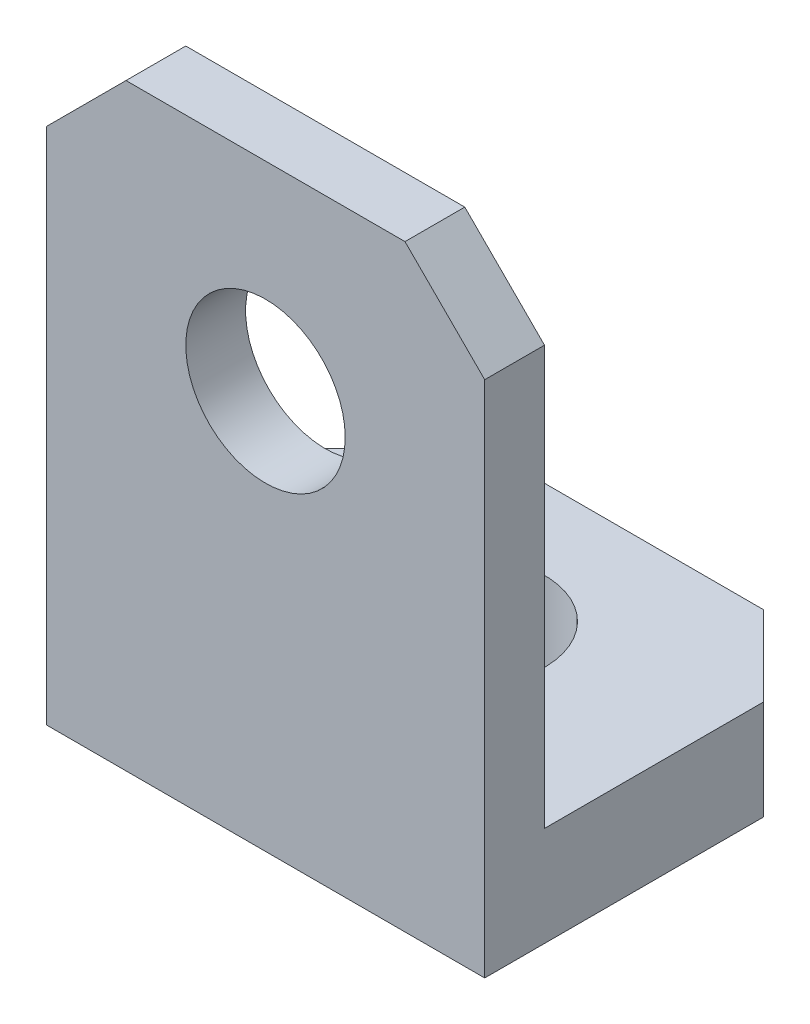
ISO-10303-21;
HEADER;
FILE_DESCRIPTION(('STEP AP214'),'2;1');
FILE_NAME('part.step','',(''),(''),'','','');
FILE_SCHEMA(('AUTOMOTIVE_DESIGN { 1 0 10303 214 1 1 1 1 }'));
ENDSEC;
DATA;
#1=APPLICATION_CONTEXT('core data for automotive mechanical design processes');
#2=APPLICATION_PROTOCOL_DEFINITION('international standard','automotive_design',2000,#1);
#3=PRODUCT_CONTEXT('',#1,'mechanical');
#4=PRODUCT('Part','Part','',(#3));
#5=PRODUCT_RELATED_PRODUCT_CATEGORY('part','',(#4));
#6=PRODUCT_DEFINITION_FORMATION('','',#4);
#7=PRODUCT_DEFINITION_CONTEXT('part definition',#1,'design');
#8=PRODUCT_DEFINITION('design','',#6,#7);
#9=PRODUCT_DEFINITION_SHAPE('','',#8);
#10=(LENGTH_UNIT() NAMED_UNIT(*) SI_UNIT(.MILLI.,.METRE.));
#11=(NAMED_UNIT(*) PLANE_ANGLE_UNIT() SI_UNIT($,.RADIAN.));
#12=(NAMED_UNIT(*) SI_UNIT($,.STERADIAN.) SOLID_ANGLE_UNIT());
#13=UNCERTAINTY_MEASURE_WITH_UNIT(LENGTH_MEASURE(1.E-05),#10,'distance_accuracy_value','');
#14=(GEOMETRIC_REPRESENTATION_CONTEXT(3) GLOBAL_UNCERTAINTY_ASSIGNED_CONTEXT((#13)) GLOBAL_UNIT_ASSIGNED_CONTEXT((#10,
#11,#12)) REPRESENTATION_CONTEXT('',''));
#15=CARTESIAN_POINT('',(0.,0.,0.));
#16=DIRECTION('',(0.,0.,1.));
#17=DIRECTION('',(1.,0.,0.));
#18=AXIS2_PLACEMENT_3D('',#15,#16,#17);
#19=CARTESIAN_POINT('',(0.,5.,0.));
#20=DIRECTION('',(0.,1.,0.));
#21=DIRECTION('',(0.,0.,1.));
#22=AXIS2_PLACEMENT_3D('',#19,#20,#21);
#23=PLANE('',#22);
#24=CARTESIAN_POINT('',(-0.467181467181457,5.,1.97683397683397));
#25=DIRECTION('',(0.,1.,0.));
#26=DIRECTION('',(0.,0.,1.));
#27=AXIS2_PLACEMENT_3D('',#24,#25,#26);
#28=CIRCLE('',#27,4.);
#29=CARTESIAN_POINT('',(-0.467181467181457,5.,5.97683397683397));
#30=VERTEX_POINT('',#29);
#31=EDGE_CURVE('E147',#30,#30,#28,.T.);
#32=ORIENTED_EDGE('',*,*,#31,.F.);
#33=EDGE_LOOP('',(#32));
#34=FACE_BOUND('',#33,.T.);
#35=DIRECTION('',(0.,0.,-1.));
#36=VECTOR('',#35,1.);
#37=CARTESIAN_POINT('',(10.5328185328185,5.,-6.02316602316603));
#38=LINE('',#37,#36);
#39=CARTESIAN_POINT('',(10.5328185328185,5.,8.97683397683397));
#40=VERTEX_POINT('',#39);
#41=CARTESIAN_POINT('',(10.5328185328185,5.,-2.02316602316601));
#42=VERTEX_POINT('',#41);
#43=EDGE_CURVE('E131',#40,#42,#38,.T.);
#44=ORIENTED_EDGE('',*,*,#43,.T.);
#45=DIRECTION('',(0.707106781186547,0.,0.707106781186548));
#46=VECTOR('',#45,1.);
#47=CARTESIAN_POINT('',(6.27799227799229,5.,-6.27799227799227));
#48=LINE('',#47,#46);
#49=CARTESIAN_POINT('',(6.53281853281853,5.,-6.02316602316603));
#50=VERTEX_POINT('',#49);
#51=EDGE_CURVE('E185',#42,#50,#48,.F.);
#52=ORIENTED_EDGE('',*,*,#51,.T.);
#53=DIRECTION('',(-1.,0.,0.));
#54=VECTOR('',#53,1.);
#55=CARTESIAN_POINT('',(-11.4671814671815,5.,-6.02316602316603));
#56=LINE('',#55,#54);
#57=CARTESIAN_POINT('',(-7.46718146718144,5.,-6.02316602316603));
#58=VERTEX_POINT('',#57);
#59=EDGE_CURVE('E154',#50,#58,#56,.T.);
#60=ORIENTED_EDGE('',*,*,#59,.T.);
#61=DIRECTION('',(0.707106781186549,0.,-0.707106781186546));
#62=VECTOR('',#61,1.);
#63=CARTESIAN_POINT('',(-6.74517374517372,5.,-6.74517374517375));
#64=LINE('',#63,#62);
#65=CARTESIAN_POINT('',(-11.4671814671815,5.,-2.02316602316603));
#66=VERTEX_POINT('',#65);
#67=EDGE_CURVE('E130',#58,#66,#64,.F.);
#68=ORIENTED_EDGE('',*,*,#67,.T.);
#69=DIRECTION('',(0.,0.,1.));
#70=VECTOR('',#69,1.);
#71=CARTESIAN_POINT('',(-11.4671814671815,5.,-6.02316602316603));
#72=LINE('',#71,#70);
#73=CARTESIAN_POINT('',(-11.4671814671815,5.,8.97683397683397));
#74=VERTEX_POINT('',#73);
#75=EDGE_CURVE('E115',#66,#74,#72,.T.);
#76=ORIENTED_EDGE('',*,*,#75,.T.);
#77=DIRECTION('',(1.,0.,0.));
#78=VECTOR('',#77,1.);
#79=CARTESIAN_POINT('',(-11.4671814671815,5.,8.97683397683397));
#80=LINE('',#79,#78);
#81=EDGE_CURVE('E121',#74,#40,#80,.T.);
#82=ORIENTED_EDGE('',*,*,#81,.T.);
#83=EDGE_LOOP('',(#44,#52,#60,#68,#76,#82));
#84=FACE_BOUND('',#83,.T.);
#85=ADVANCED_FACE('F35',(#34,#84),#23,.T.);
#86=CARTESIAN_POINT('',(0.,0.,0.));
#87=DIRECTION('',(0.,1.,0.));
#88=DIRECTION('',(0.,0.,1.));
#89=AXIS2_PLACEMENT_3D('',#86,#87,#88);
#90=PLANE('',#89);
#91=DIRECTION('',(-1.,0.,0.));
#92=VECTOR('',#91,1.);
#93=CARTESIAN_POINT('',(-11.4671814671815,0.,-6.02316602316603));
#94=LINE('',#93,#92);
#95=CARTESIAN_POINT('',(6.53281853281853,0.,-6.02316602316603));
#96=VERTEX_POINT('',#95);
#97=CARTESIAN_POINT('',(-7.46718146718144,0.,-6.02316602316603));
#98=VERTEX_POINT('',#97);
#99=EDGE_CURVE('E132',#96,#98,#94,.T.);
#100=ORIENTED_EDGE('',*,*,#99,.F.);
#101=DIRECTION('',(-0.707106781186547,0.,-0.707106781186548));
#102=VECTOR('',#101,1.);
#103=CARTESIAN_POINT('',(6.53281853281853,0.,-6.02316602316603));
#104=LINE('',#103,#102);
#105=CARTESIAN_POINT('',(10.5328185328185,0.,-2.02316602316601));
#106=VERTEX_POINT('',#105);
#107=EDGE_CURVE('E177',#96,#106,#104,.F.);
#108=ORIENTED_EDGE('',*,*,#107,.T.);
#109=DIRECTION('',(0.,0.,-1.));
#110=VECTOR('',#109,1.);
#111=CARTESIAN_POINT('',(10.5328185328185,0.,-6.02316602316603));
#112=LINE('',#111,#110);
#113=CARTESIAN_POINT('',(10.5328185328185,0.,11.976833976834));
#114=VERTEX_POINT('',#113);
#115=EDGE_CURVE('E162',#114,#106,#112,.T.);
#116=ORIENTED_EDGE('',*,*,#115,.F.);
#117=DIRECTION('',(1.,0.,0.));
#118=VECTOR('',#117,1.);
#119=CARTESIAN_POINT('',(-11.4671814671815,0.,11.976833976834));
#120=LINE('',#119,#118);
#121=CARTESIAN_POINT('',(-11.4671814671815,0.,11.976833976834));
#122=VERTEX_POINT('',#121);
#123=EDGE_CURVE('E159',#122,#114,#120,.T.);
#124=ORIENTED_EDGE('',*,*,#123,.F.);
#125=DIRECTION('',(0.,0.,1.));
#126=VECTOR('',#125,1.);
#127=CARTESIAN_POINT('',(-11.4671814671815,0.,-6.02316602316603));
#128=LINE('',#127,#126);
#129=CARTESIAN_POINT('',(-11.4671814671815,0.,-2.02316602316603));
#130=VERTEX_POINT('',#129);
#131=EDGE_CURVE('E150',#130,#122,#128,.T.);
#132=ORIENTED_EDGE('',*,*,#131,.F.);
#133=DIRECTION('',(-0.707106781186549,0.,0.707106781186546));
#134=VECTOR('',#133,1.);
#135=CARTESIAN_POINT('',(-11.4671814671815,0.,-2.02316602316603));
#136=LINE('',#135,#134);
#137=EDGE_CURVE('E175',#130,#98,#136,.F.);
#138=ORIENTED_EDGE('',*,*,#137,.T.);
#139=EDGE_LOOP('',(#100,#108,#116,#124,#132,#138));
#140=FACE_BOUND('',#139,.T.);
#141=CARTESIAN_POINT('',(-0.467181467181457,0.,1.97683397683397));
#142=DIRECTION('',(0.,1.,0.));
#143=DIRECTION('',(0.,0.,1.));
#144=AXIS2_PLACEMENT_3D('',#141,#142,#143);
#145=CIRCLE('',#144,4.);
#146=CARTESIAN_POINT('',(-0.467181467181457,0.,5.97683397683397));
#147=VERTEX_POINT('',#146);
#148=EDGE_CURVE('E143',#147,#147,#145,.T.);
#149=ORIENTED_EDGE('',*,*,#148,.T.);
#150=EDGE_LOOP('',(#149));
#151=FACE_BOUND('',#150,.T.);
#152=ADVANCED_FACE('F221',(#140,#151),#90,.F.);
#153=CARTESIAN_POINT('',(-11.4671814671815,5.,-6.02316602316603));
#154=DIRECTION('',(1.,0.,0.));
#155=DIRECTION('',(0.,0.,-1.));
#156=AXIS2_PLACEMENT_3D('',#153,#154,#155);
#157=PLANE('',#156);
#158=ORIENTED_EDGE('',*,*,#75,.F.);
#159=DIRECTION('',(0.,-1.,0.));
#160=VECTOR('',#159,1.);
#161=CARTESIAN_POINT('',(-11.4671814671815,5.,-2.02316602316603));
#162=LINE('',#161,#160);
#163=EDGE_CURVE('E188',#66,#130,#162,.T.);
#164=ORIENTED_EDGE('',*,*,#163,.T.);
#165=ORIENTED_EDGE('',*,*,#131,.T.);
#166=DIRECTION('',(0.,-1.,0.));
#167=VECTOR('',#166,1.);
#168=CARTESIAN_POINT('',(-11.4671814671815,5.,11.976833976834));
#169=LINE('',#168,#167);
#170=CARTESIAN_POINT('',(-11.4671814671815,26.,11.976833976834));
#171=VERTEX_POINT('',#170);
#172=EDGE_CURVE('E168',#171,#122,#169,.T.);
#173=ORIENTED_EDGE('',*,*,#172,.F.);
#174=DIRECTION('',(0.,0.,-1.));
#175=VECTOR('',#174,1.);
#176=CARTESIAN_POINT('',(-11.4671814671815,26.,8.97683397683397));
#177=LINE('',#176,#175);
#178=CARTESIAN_POINT('',(-11.4671814671815,26.,8.97683397683397));
#179=VERTEX_POINT('',#178);
#180=EDGE_CURVE('E119',#171,#179,#177,.T.);
#181=ORIENTED_EDGE('',*,*,#180,.T.);
#182=DIRECTION('',(0.,-1.,0.));
#183=VECTOR('',#182,1.);
#184=CARTESIAN_POINT('',(-11.4671814671815,5.,8.97683397683397));
#185=LINE('',#184,#183);
#186=EDGE_CURVE('E111',#179,#74,#185,.T.);
#187=ORIENTED_EDGE('',*,*,#186,.T.);
#188=EDGE_LOOP('',(#158,#164,#165,#173,#181,#187));
#189=FACE_BOUND('',#188,.T.);
#190=ADVANCED_FACE('F113',(#189),#157,.F.);
#191=CARTESIAN_POINT('',(-11.4671814671815,5.,11.976833976834));
#192=DIRECTION('',(0.,0.,-1.));
#193=DIRECTION('',(-1.,0.,0.));
#194=AXIS2_PLACEMENT_3D('',#191,#192,#193);
#195=PLANE('',#194);
#196=DIRECTION('',(0.,-1.,0.));
#197=VECTOR('',#196,1.);
#198=CARTESIAN_POINT('',(10.5328185328185,5.,11.976833976834));
#199=LINE('',#198,#197);
#200=CARTESIAN_POINT('',(10.5328185328185,26.,11.976833976834));
#201=VERTEX_POINT('',#200);
#202=EDGE_CURVE('E156',#201,#114,#199,.T.);
#203=ORIENTED_EDGE('',*,*,#202,.F.);
#204=DIRECTION('',(-0.707106781186549,0.707106781186546,0.));
#205=VECTOR('',#204,1.);
#206=CARTESIAN_POINT('',(10.5328185328185,26.,11.976833976834));
#207=LINE('',#206,#205);
#208=CARTESIAN_POINT('',(6.53281853281853,30.,11.976833976834));
#209=VERTEX_POINT('',#208);
#210=EDGE_CURVE('E192',#201,#209,#207,.T.);
#211=ORIENTED_EDGE('',*,*,#210,.T.);
#212=DIRECTION('',(-1.,0.,0.));
#213=VECTOR('',#212,1.);
#214=CARTESIAN_POINT('',(-11.4671814671815,30.,11.976833976834));
#215=LINE('',#214,#213);
#216=CARTESIAN_POINT('',(-7.46718146718146,30.,11.976833976834));
#217=VERTEX_POINT('',#216);
#218=EDGE_CURVE('E122',#209,#217,#215,.T.);
#219=ORIENTED_EDGE('',*,*,#218,.T.);
#220=DIRECTION('',(-0.707106781186547,-0.707106781186548,0.));
#221=VECTOR('',#220,1.);
#222=CARTESIAN_POINT('',(-7.46718146718146,30.,11.976833976834));
#223=LINE('',#222,#221);
#224=EDGE_CURVE('E190',#217,#171,#223,.T.);
#225=ORIENTED_EDGE('',*,*,#224,.T.);
#226=ORIENTED_EDGE('',*,*,#172,.T.);
#227=ORIENTED_EDGE('',*,*,#123,.T.);
#228=EDGE_LOOP('',(#203,#211,#219,#225,#226,#227));
#229=FACE_BOUND('',#228,.T.);
#230=CARTESIAN_POINT('',(-0.467181467181457,20.,11.976833976834));
#231=DIRECTION('',(0.,0.,1.));
#232=DIRECTION('',(1.,0.,0.));
#233=AXIS2_PLACEMENT_3D('',#230,#231,#232);
#234=CIRCLE('',#233,4.);
#235=CARTESIAN_POINT('',(3.53281853281854,20.,11.976833976834));
#236=VERTEX_POINT('',#235);
#237=EDGE_CURVE('E358',#236,#236,#234,.T.);
#238=ORIENTED_EDGE('',*,*,#237,.F.);
#239=EDGE_LOOP('',(#238));
#240=FACE_BOUND('',#239,.T.);
#241=ADVANCED_FACE('F202',(#229,#240),#195,.F.);
#242=CARTESIAN_POINT('',(10.5328185328185,5.,-6.02316602316603));
#243=DIRECTION('',(-1.,0.,0.));
#244=DIRECTION('',(0.,0.,1.));
#245=AXIS2_PLACEMENT_3D('',#242,#243,#244);
#246=PLANE('',#245);
#247=ORIENTED_EDGE('',*,*,#115,.T.);
#248=DIRECTION('',(0.,1.,0.));
#249=VECTOR('',#248,1.);
#250=CARTESIAN_POINT('',(10.5328185328185,5.,-2.02316602316601));
#251=LINE('',#250,#249);
#252=EDGE_CURVE('E182',#106,#42,#251,.T.);
#253=ORIENTED_EDGE('',*,*,#252,.T.);
#254=ORIENTED_EDGE('',*,*,#43,.F.);
#255=DIRECTION('',(0.,1.,0.));
#256=VECTOR('',#255,1.);
#257=CARTESIAN_POINT('',(10.5328185328185,5.,8.97683397683397));
#258=LINE('',#257,#256);
#259=CARTESIAN_POINT('',(10.5328185328185,26.,8.97683397683397));
#260=VERTEX_POINT('',#259);
#261=EDGE_CURVE('E136',#40,#260,#258,.T.);
#262=ORIENTED_EDGE('',*,*,#261,.T.);
#263=DIRECTION('',(0.,0.,1.));
#264=VECTOR('',#263,1.);
#265=CARTESIAN_POINT('',(10.5328185328185,26.,11.976833976834));
#266=LINE('',#265,#264);
#267=EDGE_CURVE('E179',#260,#201,#266,.T.);
#268=ORIENTED_EDGE('',*,*,#267,.T.);
#269=ORIENTED_EDGE('',*,*,#202,.T.);
#270=EDGE_LOOP('',(#247,#253,#254,#262,#268,#269));
#271=FACE_BOUND('',#270,.T.);
#272=ADVANCED_FACE('F209',(#271),#246,.F.);
#273=CARTESIAN_POINT('',(-11.4671814671815,5.,-6.02316602316603));
#274=DIRECTION('',(0.,0.,1.));
#275=DIRECTION('',(1.,0.,0.));
#276=AXIS2_PLACEMENT_3D('',#273,#274,#275);
#277=PLANE('',#276);
#278=ORIENTED_EDGE('',*,*,#59,.F.);
#279=DIRECTION('',(0.,-1.,0.));
#280=VECTOR('',#279,1.);
#281=CARTESIAN_POINT('',(6.53281853281853,5.,-6.02316602316603));
#282=LINE('',#281,#280);
#283=EDGE_CURVE('E172',#50,#96,#282,.T.);
#284=ORIENTED_EDGE('',*,*,#283,.T.);
#285=ORIENTED_EDGE('',*,*,#99,.T.);
#286=DIRECTION('',(0.,1.,0.));
#287=VECTOR('',#286,1.);
#288=CARTESIAN_POINT('',(-7.46718146718144,5.,-6.02316602316603));
#289=LINE('',#288,#287);
#290=EDGE_CURVE('E170',#98,#58,#289,.T.);
#291=ORIENTED_EDGE('',*,*,#290,.T.);
#292=EDGE_LOOP('',(#278,#284,#285,#291));
#293=FACE_BOUND('',#292,.T.);
#294=ADVANCED_FACE('F218',(#293),#277,.F.);
#295=CARTESIAN_POINT('',(-0.467181467181457,5.,1.97683397683397));
#296=DIRECTION('',(0.,-1.,0.));
#297=DIRECTION('',(0.,0.,-1.));
#298=AXIS2_PLACEMENT_3D('',#295,#296,#297);
#299=CYLINDRICAL_SURFACE('',#298,4.);
#300=ORIENTED_EDGE('',*,*,#31,.T.);
#301=EDGE_LOOP('',(#300));
#302=FACE_BOUND('',#301,.T.);
#303=ORIENTED_EDGE('',*,*,#148,.F.);
#304=EDGE_LOOP('',(#303));
#305=FACE_BOUND('',#304,.T.);
#306=ADVANCED_FACE('F241',(#302,#305),#299,.F.);
#307=CARTESIAN_POINT('',(-11.4671814671815,30.,8.97683397683397));
#308=DIRECTION('',(0.,1.,0.));
#309=DIRECTION('',(0.,0.,1.));
#310=AXIS2_PLACEMENT_3D('',#307,#308,#309);
#311=PLANE('',#310);
#312=ORIENTED_EDGE('',*,*,#218,.F.);
#313=DIRECTION('',(0.,0.,-1.));
#314=VECTOR('',#313,1.);
#315=CARTESIAN_POINT('',(6.53281853281853,30.,8.97683397683397));
#316=LINE('',#315,#314);
#317=CARTESIAN_POINT('',(6.53281853281853,30.,8.97683397683397));
#318=VERTEX_POINT('',#317);
#319=EDGE_CURVE('E56',#209,#318,#316,.T.);
#320=ORIENTED_EDGE('',*,*,#319,.T.);
#321=DIRECTION('',(-1.,0.,0.));
#322=VECTOR('',#321,1.);
#323=CARTESIAN_POINT('',(-11.4671814671815,30.,8.97683397683397));
#324=LINE('',#323,#322);
#325=CARTESIAN_POINT('',(-7.46718146718146,30.,8.97683397683397));
#326=VERTEX_POINT('',#325);
#327=EDGE_CURVE('E138',#318,#326,#324,.T.);
#328=ORIENTED_EDGE('',*,*,#327,.T.);
#329=DIRECTION('',(0.,0.,1.));
#330=VECTOR('',#329,1.);
#331=CARTESIAN_POINT('',(-7.46718146718146,30.,11.976833976834));
#332=LINE('',#331,#330);
#333=EDGE_CURVE('E194',#326,#217,#332,.T.);
#334=ORIENTED_EDGE('',*,*,#333,.T.);
#335=EDGE_LOOP('',(#312,#320,#328,#334));
#336=FACE_BOUND('',#335,.T.);
#337=ADVANCED_FACE('F198',(#336),#311,.T.);
#338=CARTESIAN_POINT('',(0.,0.,8.97683397683397));
#339=DIRECTION('',(0.,0.,-1.));
#340=DIRECTION('',(-1.,0.,0.));
#341=AXIS2_PLACEMENT_3D('',#338,#339,#340);
#342=PLANE('',#341);
#343=CARTESIAN_POINT('',(-0.467181467181457,20.,8.97683397683397));
#344=DIRECTION('',(0.,0.,1.));
#345=DIRECTION('',(1.,0.,0.));
#346=AXIS2_PLACEMENT_3D('',#343,#344,#345);
#347=CIRCLE('',#346,4.);
#348=CARTESIAN_POINT('',(3.53281853281854,20.,8.97683397683397));
#349=VERTEX_POINT('',#348);
#350=EDGE_CURVE('E146',#349,#349,#347,.T.);
#351=ORIENTED_EDGE('',*,*,#350,.T.);
#352=EDGE_LOOP('',(#351));
#353=FACE_BOUND('',#352,.T.);
#354=ORIENTED_EDGE('',*,*,#327,.F.);
#355=DIRECTION('',(0.707106781186549,-0.707106781186546,0.));
#356=VECTOR('',#355,1.);
#357=CARTESIAN_POINT('',(18.2664092664093,18.2664092664093,8.97683397683397));
#358=LINE('',#357,#356);
#359=EDGE_CURVE('E11',#318,#260,#358,.T.);
#360=ORIENTED_EDGE('',*,*,#359,.T.);
#361=ORIENTED_EDGE('',*,*,#261,.F.);
#362=ORIENTED_EDGE('',*,*,#81,.F.);
#363=ORIENTED_EDGE('',*,*,#186,.F.);
#364=DIRECTION('',(0.707106781186547,0.707106781186548,0.));
#365=VECTOR('',#364,1.);
#366=CARTESIAN_POINT('',(-18.7335907335907,18.7335907335907,8.97683397683397));
#367=LINE('',#366,#365);
#368=EDGE_CURVE('E43',#179,#326,#367,.T.);
#369=ORIENTED_EDGE('',*,*,#368,.T.);
#370=EDGE_LOOP('',(#354,#360,#361,#362,#363,#369));
#371=FACE_BOUND('',#370,.T.);
#372=ADVANCED_FACE('F134',(#353,#371),#342,.T.);
#373=CARTESIAN_POINT('',(-0.467181467181457,20.,8.97683397683397));
#374=DIRECTION('',(0.,0.,1.));
#375=DIRECTION('',(1.,0.,0.));
#376=AXIS2_PLACEMENT_3D('',#373,#374,#375);
#377=CYLINDRICAL_SURFACE('',#376,4.);
#378=ORIENTED_EDGE('',*,*,#350,.F.);
#379=EDGE_LOOP('',(#378));
#380=FACE_BOUND('',#379,.T.);
#381=ORIENTED_EDGE('',*,*,#237,.T.);
#382=EDGE_LOOP('',(#381));
#383=FACE_BOUND('',#382,.T.);
#384=ADVANCED_FACE('F254',(#380,#383),#377,.F.);
#385=CARTESIAN_POINT('',(6.53281853281853,5.,-6.02316602316603));
#386=DIRECTION('',(-0.707106781186548,0.,0.707106781186547));
#387=DIRECTION('',(0.,-1.,0.));
#388=AXIS2_PLACEMENT_3D('',#385,#386,#387);
#389=PLANE('',#388);
#390=ORIENTED_EDGE('',*,*,#51,.F.);
#391=ORIENTED_EDGE('',*,*,#252,.F.);
#392=ORIENTED_EDGE('',*,*,#107,.F.);
#393=ORIENTED_EDGE('',*,*,#283,.F.);
#394=EDGE_LOOP('',(#390,#391,#392,#393));
#395=FACE_BOUND('',#394,.T.);
#396=ADVANCED_FACE('F215',(#395),#389,.F.);
#397=CARTESIAN_POINT('',(-11.4671814671815,5.,-2.02316602316603));
#398=DIRECTION('',(0.707106781186546,0.,0.707106781186549));
#399=DIRECTION('',(0.,-1.,0.));
#400=AXIS2_PLACEMENT_3D('',#397,#398,#399);
#401=PLANE('',#400);
#402=ORIENTED_EDGE('',*,*,#67,.F.);
#403=ORIENTED_EDGE('',*,*,#290,.F.);
#404=ORIENTED_EDGE('',*,*,#137,.F.);
#405=ORIENTED_EDGE('',*,*,#163,.F.);
#406=EDGE_LOOP('',(#402,#403,#404,#405));
#407=FACE_BOUND('',#406,.T.);
#408=ADVANCED_FACE('F227',(#407),#401,.F.);
#409=CARTESIAN_POINT('',(10.5328185328185,26.,-6.02316602316603));
#410=DIRECTION('',(0.707106781186546,0.707106781186549,0.));
#411=DIRECTION('',(0.,0.,-1.));
#412=AXIS2_PLACEMENT_3D('',#409,#410,#411);
#413=PLANE('',#412);
#414=ORIENTED_EDGE('',*,*,#359,.F.);
#415=ORIENTED_EDGE('',*,*,#319,.F.);
#416=ORIENTED_EDGE('',*,*,#210,.F.);
#417=ORIENTED_EDGE('',*,*,#267,.F.);
#418=EDGE_LOOP('',(#414,#415,#416,#417));
#419=FACE_BOUND('',#418,.T.);
#420=ADVANCED_FACE('F207',(#419),#413,.T.);
#421=CARTESIAN_POINT('',(-7.46718146718146,30.,8.97683397683397));
#422=DIRECTION('',(-0.707106781186548,0.707106781186547,0.));
#423=DIRECTION('',(0.,0.,-1.));
#424=AXIS2_PLACEMENT_3D('',#421,#422,#423);
#425=PLANE('',#424);
#426=ORIENTED_EDGE('',*,*,#368,.F.);
#427=ORIENTED_EDGE('',*,*,#180,.F.);
#428=ORIENTED_EDGE('',*,*,#224,.F.);
#429=ORIENTED_EDGE('',*,*,#333,.F.);
#430=EDGE_LOOP('',(#426,#427,#428,#429));
#431=FACE_BOUND('',#430,.T.);
#432=ADVANCED_FACE('F37',(#431),#425,.T.);
#433=CLOSED_SHELL('',(#85,#152,#190,#241,#272,#294,#306,#337,#372,#384,#396,#408,#420,#432));
#434=MANIFOLD_SOLID_BREP('B2',#433);
#435=ADVANCED_BREP_SHAPE_REPRESENTATION('',(#18,#434),#14);
#436=SHAPE_DEFINITION_REPRESENTATION(#9,#435);
ENDSEC;
END-ISO-10303-21;
